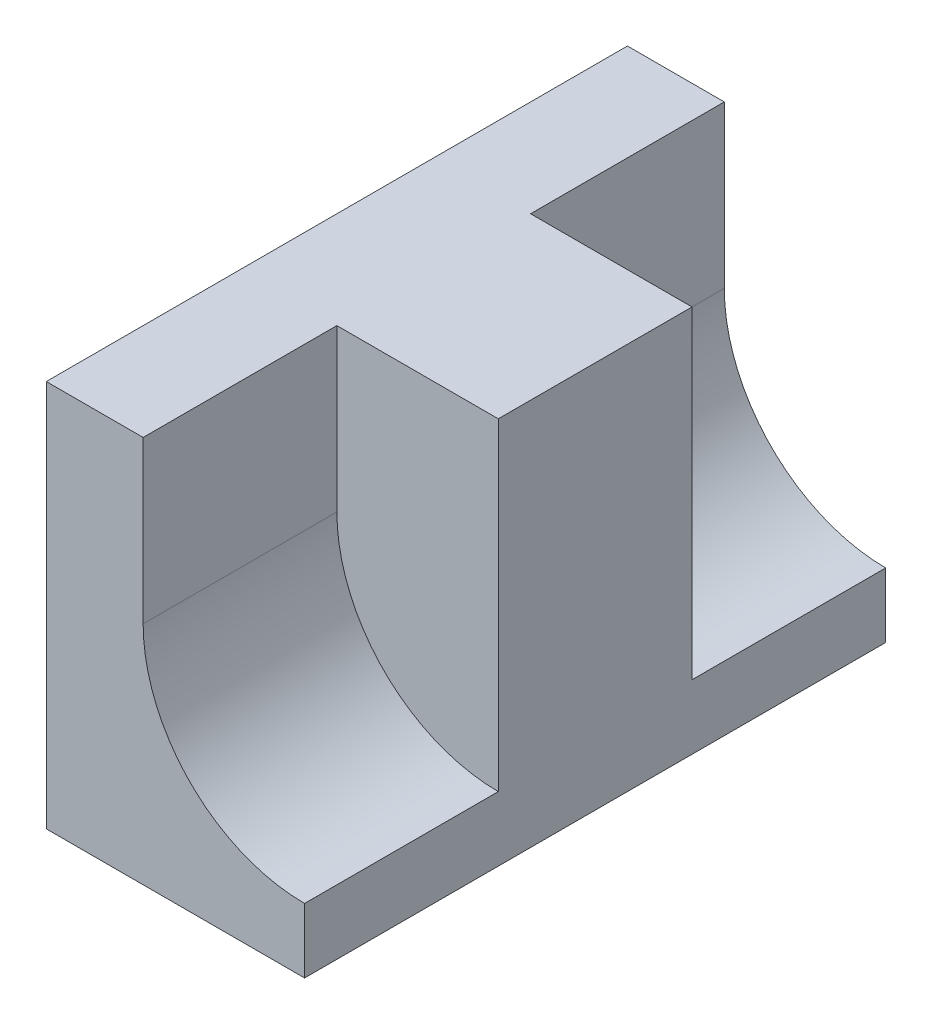
ISO-10303-21;
HEADER;
FILE_DESCRIPTION(('STEP AP214'),'2;1');
FILE_NAME('part.step','',(''),(''),'','','');
FILE_SCHEMA(('AUTOMOTIVE_DESIGN { 1 0 10303 214 1 1 1 1 }'));
ENDSEC;
DATA;
#1=APPLICATION_CONTEXT('core data for automotive mechanical design processes');
#2=APPLICATION_PROTOCOL_DEFINITION('international standard','automotive_design',2000,#1);
#3=PRODUCT_CONTEXT('',#1,'mechanical');
#4=PRODUCT('Part','Part','',(#3));
#5=PRODUCT_RELATED_PRODUCT_CATEGORY('part','',(#4));
#6=PRODUCT_DEFINITION_FORMATION('','',#4);
#7=PRODUCT_DEFINITION_CONTEXT('part definition',#1,'design');
#8=PRODUCT_DEFINITION('design','',#6,#7);
#9=PRODUCT_DEFINITION_SHAPE('','',#8);
#10=(LENGTH_UNIT() NAMED_UNIT(*) SI_UNIT(.MILLI.,.METRE.));
#11=(NAMED_UNIT(*) PLANE_ANGLE_UNIT() SI_UNIT($,.RADIAN.));
#12=(NAMED_UNIT(*) SI_UNIT($,.STERADIAN.) SOLID_ANGLE_UNIT());
#13=UNCERTAINTY_MEASURE_WITH_UNIT(LENGTH_MEASURE(1.E-05),#10,'distance_accuracy_value','');
#14=(GEOMETRIC_REPRESENTATION_CONTEXT(3) GLOBAL_UNCERTAINTY_ASSIGNED_CONTEXT((#13)) GLOBAL_UNIT_ASSIGNED_CONTEXT((#10,
#11,#12)) REPRESENTATION_CONTEXT('',''));
#15=CARTESIAN_POINT('',(0.,0.,0.));
#16=DIRECTION('',(0.,0.,1.));
#17=DIRECTION('',(1.,0.,0.));
#18=AXIS2_PLACEMENT_3D('',#15,#16,#17);
#19=CARTESIAN_POINT('',(40.,35.,45.));
#20=DIRECTION('',(0.,0.,-1.));
#21=DIRECTION('',(-1.,0.,0.));
#22=AXIS2_PLACEMENT_3D('',#19,#20,#21);
#23=CYLINDRICAL_SURFACE('',#22,25.);
#24=DIRECTION('',(0.,0.,-1.));
#25=VECTOR('',#24,1.);
#26=CARTESIAN_POINT('',(15.,35.,45.));
#27=LINE('',#26,#25);
#28=CARTESIAN_POINT('',(15.,35.,-15.));
#29=VERTEX_POINT('',#28);
#30=CARTESIAN_POINT('',(15.,35.,-45.));
#31=VERTEX_POINT('',#30);
#32=EDGE_CURVE('E43',#29,#31,#27,.T.);
#33=ORIENTED_EDGE('',*,*,#32,.F.);
#34=CARTESIAN_POINT('',(40.,35.,-15.));
#35=DIRECTION('',(0.,0.,1.));
#36=DIRECTION('',(1.,0.,0.));
#37=AXIS2_PLACEMENT_3D('',#34,#35,#36);
#38=CIRCLE('',#37,25.);
#39=CARTESIAN_POINT('',(40.,10.,-15.));
#40=VERTEX_POINT('',#39);
#41=EDGE_CURVE('E140',#29,#40,#38,.T.);
#42=ORIENTED_EDGE('',*,*,#41,.T.);
#43=DIRECTION('',(0.,0.,-1.));
#44=VECTOR('',#43,1.);
#45=CARTESIAN_POINT('',(40.,10.,45.));
#46=LINE('',#45,#44);
#47=CARTESIAN_POINT('',(40.,10.,-45.));
#48=VERTEX_POINT('',#47);
#49=EDGE_CURVE('E163',#40,#48,#46,.T.);
#50=ORIENTED_EDGE('',*,*,#49,.T.);
#51=CARTESIAN_POINT('',(40.,35.,-45.));
#52=DIRECTION('',(0.,0.,1.));
#53=DIRECTION('',(1.,0.,0.));
#54=AXIS2_PLACEMENT_3D('',#51,#52,#53);
#55=CIRCLE('',#54,25.);
#56=EDGE_CURVE('E129',#31,#48,#55,.T.);
#57=ORIENTED_EDGE('',*,*,#56,.F.);
#58=EDGE_LOOP('',(#33,#42,#50,#57));
#59=FACE_BOUND('',#58,.T.);
#60=ADVANCED_FACE('F35',(#59),#23,.F.);
#61=CARTESIAN_POINT('',(15.,0.,45.));
#62=DIRECTION('',(1.,0.,0.));
#63=DIRECTION('',(0.,1.,0.));
#64=AXIS2_PLACEMENT_3D('',#61,#62,#63);
#65=PLANE('',#64);
#66=DIRECTION('',(0.,0.,-1.));
#67=VECTOR('',#66,1.);
#68=CARTESIAN_POINT('',(15.,60.,45.));
#69=LINE('',#68,#67);
#70=CARTESIAN_POINT('',(15.,60.,-15.));
#71=VERTEX_POINT('',#70);
#72=CARTESIAN_POINT('',(15.,60.,-45.));
#73=VERTEX_POINT('',#72);
#74=EDGE_CURVE('E186',#71,#73,#69,.T.);
#75=ORIENTED_EDGE('',*,*,#74,.F.);
#76=DIRECTION('',(0.,-1.,0.));
#77=VECTOR('',#76,1.);
#78=CARTESIAN_POINT('',(15.,0.,-15.));
#79=LINE('',#78,#77);
#80=EDGE_CURVE('E50',#71,#29,#79,.T.);
#81=ORIENTED_EDGE('',*,*,#80,.T.);
#82=ORIENTED_EDGE('',*,*,#32,.T.);
#83=DIRECTION('',(0.,-1.,0.));
#84=VECTOR('',#83,1.);
#85=CARTESIAN_POINT('',(15.,0.,-45.));
#86=LINE('',#85,#84);
#87=EDGE_CURVE('E166',#73,#31,#86,.T.);
#88=ORIENTED_EDGE('',*,*,#87,.F.);
#89=EDGE_LOOP('',(#75,#81,#82,#88));
#90=FACE_BOUND('',#89,.T.);
#91=ADVANCED_FACE('F188',(#90),#65,.T.);
#92=CARTESIAN_POINT('',(40.,35.,15.));
#93=DIRECTION('',(0.,0.,1.));
#94=DIRECTION('',(1.,0.,0.));
#95=AXIS2_PLACEMENT_3D('',#92,#93,#94);
#96=CIRCLE('',#95,25.);
#97=CARTESIAN_POINT('',(15.,35.,15.));
#98=VERTEX_POINT('',#97);
#99=CARTESIAN_POINT('',(40.,10.,15.));
#100=VERTEX_POINT('',#99);
#101=EDGE_CURVE('E58',#98,#100,#96,.T.);
#102=ORIENTED_EDGE('',*,*,#101,.F.);
#103=CARTESIAN_POINT('',(15.,35.,45.));
#104=VERTEX_POINT('',#103);
#105=EDGE_CURVE('E11',#104,#98,#27,.T.);
#106=ORIENTED_EDGE('',*,*,#105,.F.);
#107=CARTESIAN_POINT('',(40.,35.,45.));
#108=DIRECTION('',(0.,0.,1.));
#109=DIRECTION('',(1.,0.,0.));
#110=AXIS2_PLACEMENT_3D('',#107,#108,#109);
#111=CIRCLE('',#110,25.);
#112=CARTESIAN_POINT('',(40.,10.,45.));
#113=VERTEX_POINT('',#112);
#114=EDGE_CURVE('E147',#104,#113,#111,.T.);
#115=ORIENTED_EDGE('',*,*,#114,.T.);
#116=EDGE_CURVE('E178',#113,#100,#46,.T.);
#117=ORIENTED_EDGE('',*,*,#116,.T.);
#118=EDGE_LOOP('',(#102,#106,#115,#117));
#119=FACE_BOUND('',#118,.T.);
#120=ADVANCED_FACE('F37',(#119),#23,.F.);
#121=DIRECTION('',(0.,-1.,0.));
#122=VECTOR('',#121,1.);
#123=CARTESIAN_POINT('',(15.,0.,15.));
#124=LINE('',#123,#122);
#125=CARTESIAN_POINT('',(15.,60.,15.));
#126=VERTEX_POINT('',#125);
#127=EDGE_CURVE('E145',#126,#98,#124,.T.);
#128=ORIENTED_EDGE('',*,*,#127,.F.);
#129=CARTESIAN_POINT('',(15.,60.,45.));
#130=VERTEX_POINT('',#129);
#131=EDGE_CURVE('E135',#130,#126,#69,.T.);
#132=ORIENTED_EDGE('',*,*,#131,.F.);
#133=DIRECTION('',(0.,-1.,0.));
#134=VECTOR('',#133,1.);
#135=CARTESIAN_POINT('',(15.,0.,45.));
#136=LINE('',#135,#134);
#137=EDGE_CURVE('E150',#130,#104,#136,.T.);
#138=ORIENTED_EDGE('',*,*,#137,.T.);
#139=ORIENTED_EDGE('',*,*,#105,.T.);
#140=EDGE_LOOP('',(#128,#132,#138,#139));
#141=FACE_BOUND('',#140,.T.);
#142=ADVANCED_FACE('F205',(#141),#65,.T.);
#143=CARTESIAN_POINT('',(0.,60.,45.));
#144=DIRECTION('',(0.,1.,0.));
#145=DIRECTION('',(0.,0.,1.));
#146=AXIS2_PLACEMENT_3D('',#143,#144,#145);
#147=PLANE('',#146);
#148=DIRECTION('',(1.,0.,0.));
#149=VECTOR('',#148,1.);
#150=CARTESIAN_POINT('',(0.,60.,-45.));
#151=LINE('',#150,#149);
#152=CARTESIAN_POINT('',(0.,60.,-45.));
#153=VERTEX_POINT('',#152);
#154=EDGE_CURVE('E169',#153,#73,#151,.T.);
#155=ORIENTED_EDGE('',*,*,#154,.F.);
#156=DIRECTION('',(0.,0.,-1.));
#157=VECTOR('',#156,1.);
#158=CARTESIAN_POINT('',(0.,60.,45.));
#159=LINE('',#158,#157);
#160=CARTESIAN_POINT('',(0.,60.,45.));
#161=VERTEX_POINT('',#160);
#162=EDGE_CURVE('E185',#161,#153,#159,.T.);
#163=ORIENTED_EDGE('',*,*,#162,.F.);
#164=DIRECTION('',(1.,0.,0.));
#165=VECTOR('',#164,1.);
#166=CARTESIAN_POINT('',(0.,60.,45.));
#167=LINE('',#166,#165);
#168=EDGE_CURVE('E154',#161,#130,#167,.T.);
#169=ORIENTED_EDGE('',*,*,#168,.T.);
#170=ORIENTED_EDGE('',*,*,#131,.T.);
#171=DIRECTION('',(1.,0.,0.));
#172=VECTOR('',#171,1.);
#173=CARTESIAN_POINT('',(0.,60.,15.));
#174=LINE('',#173,#172);
#175=CARTESIAN_POINT('',(40.,60.,15.));
#176=VERTEX_POINT('',#175);
#177=EDGE_CURVE('E116',#126,#176,#174,.T.);
#178=ORIENTED_EDGE('',*,*,#177,.T.);
#179=DIRECTION('',(0.,0.,-1.));
#180=VECTOR('',#179,1.);
#181=CARTESIAN_POINT('',(40.,60.,15.));
#182=LINE('',#181,#180);
#183=CARTESIAN_POINT('',(40.,60.,-15.));
#184=VERTEX_POINT('',#183);
#185=EDGE_CURVE('E121',#176,#184,#182,.T.);
#186=ORIENTED_EDGE('',*,*,#185,.T.);
#187=DIRECTION('',(1.,0.,0.));
#188=VECTOR('',#187,1.);
#189=CARTESIAN_POINT('',(0.,60.,-15.));
#190=LINE('',#189,#188);
#191=EDGE_CURVE('E144',#71,#184,#190,.T.);
#192=ORIENTED_EDGE('',*,*,#191,.F.);
#193=ORIENTED_EDGE('',*,*,#74,.T.);
#194=EDGE_LOOP('',(#155,#163,#169,#170,#178,#186,#192,#193));
#195=FACE_BOUND('',#194,.T.);
#196=ADVANCED_FACE('F133',(#195),#147,.T.);
#197=CARTESIAN_POINT('',(0.,0.,45.));
#198=DIRECTION('',(-1.,0.,0.));
#199=DIRECTION('',(0.,0.,1.));
#200=AXIS2_PLACEMENT_3D('',#197,#198,#199);
#201=PLANE('',#200);
#202=DIRECTION('',(0.,1.,0.));
#203=VECTOR('',#202,1.);
#204=CARTESIAN_POINT('',(0.,0.,-45.));
#205=LINE('',#204,#203);
#206=CARTESIAN_POINT('',(0.,0.,-45.));
#207=VERTEX_POINT('',#206);
#208=EDGE_CURVE('E172',#207,#153,#205,.T.);
#209=ORIENTED_EDGE('',*,*,#208,.F.);
#210=DIRECTION('',(0.,0.,-1.));
#211=VECTOR('',#210,1.);
#212=CARTESIAN_POINT('',(0.,0.,45.));
#213=LINE('',#212,#211);
#214=CARTESIAN_POINT('',(0.,0.,45.));
#215=VERTEX_POINT('',#214);
#216=EDGE_CURVE('E183',#215,#207,#213,.T.);
#217=ORIENTED_EDGE('',*,*,#216,.F.);
#218=DIRECTION('',(0.,1.,0.));
#219=VECTOR('',#218,1.);
#220=CARTESIAN_POINT('',(0.,0.,45.));
#221=LINE('',#220,#219);
#222=EDGE_CURVE('E156',#215,#161,#221,.T.);
#223=ORIENTED_EDGE('',*,*,#222,.T.);
#224=ORIENTED_EDGE('',*,*,#162,.T.);
#225=EDGE_LOOP('',(#209,#217,#223,#224));
#226=FACE_BOUND('',#225,.T.);
#227=ADVANCED_FACE('F196',(#226),#201,.T.);
#228=CARTESIAN_POINT('',(0.,0.,45.));
#229=DIRECTION('',(0.,1.,0.));
#230=DIRECTION('',(0.,0.,1.));
#231=AXIS2_PLACEMENT_3D('',#228,#229,#230);
#232=PLANE('',#231);
#233=DIRECTION('',(1.,0.,0.));
#234=VECTOR('',#233,1.);
#235=CARTESIAN_POINT('',(0.,0.,-45.));
#236=LINE('',#235,#234);
#237=CARTESIAN_POINT('',(40.,0.,-45.));
#238=VERTEX_POINT('',#237);
#239=EDGE_CURVE('E175',#207,#238,#236,.T.);
#240=ORIENTED_EDGE('',*,*,#239,.T.);
#241=DIRECTION('',(0.,0.,-1.));
#242=VECTOR('',#241,1.);
#243=CARTESIAN_POINT('',(40.,0.,45.));
#244=LINE('',#243,#242);
#245=CARTESIAN_POINT('',(40.,0.,45.));
#246=VERTEX_POINT('',#245);
#247=EDGE_CURVE('E180',#246,#238,#244,.T.);
#248=ORIENTED_EDGE('',*,*,#247,.F.);
#249=DIRECTION('',(1.,0.,0.));
#250=VECTOR('',#249,1.);
#251=CARTESIAN_POINT('',(0.,0.,45.));
#252=LINE('',#251,#250);
#253=EDGE_CURVE('E159',#215,#246,#252,.T.);
#254=ORIENTED_EDGE('',*,*,#253,.F.);
#255=ORIENTED_EDGE('',*,*,#216,.T.);
#256=EDGE_LOOP('',(#240,#248,#254,#255));
#257=FACE_BOUND('',#256,.T.);
#258=ADVANCED_FACE('F210',(#257),#232,.F.);
#259=CARTESIAN_POINT('',(40.,0.,45.));
#260=DIRECTION('',(-1.,0.,0.));
#261=DIRECTION('',(0.,0.,1.));
#262=AXIS2_PLACEMENT_3D('',#259,#260,#261);
#263=PLANE('',#262);
#264=DIRECTION('',(0.,1.,0.));
#265=VECTOR('',#264,1.);
#266=CARTESIAN_POINT('',(40.,0.,-45.));
#267=LINE('',#266,#265);
#268=EDGE_CURVE('E151',#238,#48,#267,.T.);
#269=ORIENTED_EDGE('',*,*,#268,.T.);
#270=ORIENTED_EDGE('',*,*,#49,.F.);
#271=DIRECTION('',(0.,1.,0.));
#272=VECTOR('',#271,1.);
#273=CARTESIAN_POINT('',(40.,0.,-15.));
#274=LINE('',#273,#272);
#275=EDGE_CURVE('E125',#40,#184,#274,.T.);
#276=ORIENTED_EDGE('',*,*,#275,.T.);
#277=ORIENTED_EDGE('',*,*,#185,.F.);
#278=DIRECTION('',(0.,1.,0.));
#279=VECTOR('',#278,1.);
#280=CARTESIAN_POINT('',(40.,0.,15.));
#281=LINE('',#280,#279);
#282=EDGE_CURVE('E111',#100,#176,#281,.T.);
#283=ORIENTED_EDGE('',*,*,#282,.F.);
#284=ORIENTED_EDGE('',*,*,#116,.F.);
#285=DIRECTION('',(0.,1.,0.));
#286=VECTOR('',#285,1.);
#287=CARTESIAN_POINT('',(40.,0.,45.));
#288=LINE('',#287,#286);
#289=EDGE_CURVE('E161',#246,#113,#288,.T.);
#290=ORIENTED_EDGE('',*,*,#289,.F.);
#291=ORIENTED_EDGE('',*,*,#247,.T.);
#292=EDGE_LOOP('',(#269,#270,#276,#277,#283,#284,#290,#291));
#293=FACE_BOUND('',#292,.T.);
#294=ADVANCED_FACE('F123',(#293),#263,.F.);
#295=CARTESIAN_POINT('',(0.,0.,45.));
#296=DIRECTION('',(0.,0.,1.));
#297=DIRECTION('',(1.,0.,0.));
#298=AXIS2_PLACEMENT_3D('',#295,#296,#297);
#299=PLANE('',#298);
#300=ORIENTED_EDGE('',*,*,#114,.F.);
#301=ORIENTED_EDGE('',*,*,#137,.F.);
#302=ORIENTED_EDGE('',*,*,#168,.F.);
#303=ORIENTED_EDGE('',*,*,#222,.F.);
#304=ORIENTED_EDGE('',*,*,#253,.T.);
#305=ORIENTED_EDGE('',*,*,#289,.T.);
#306=EDGE_LOOP('',(#300,#301,#302,#303,#304,#305));
#307=FACE_BOUND('',#306,.T.);
#308=ADVANCED_FACE('F203',(#307),#299,.T.);
#309=CARTESIAN_POINT('',(0.,0.,-45.));
#310=DIRECTION('',(0.,0.,1.));
#311=DIRECTION('',(1.,0.,0.));
#312=AXIS2_PLACEMENT_3D('',#309,#310,#311);
#313=PLANE('',#312);
#314=ORIENTED_EDGE('',*,*,#56,.T.);
#315=ORIENTED_EDGE('',*,*,#268,.F.);
#316=ORIENTED_EDGE('',*,*,#239,.F.);
#317=ORIENTED_EDGE('',*,*,#208,.T.);
#318=ORIENTED_EDGE('',*,*,#154,.T.);
#319=ORIENTED_EDGE('',*,*,#87,.T.);
#320=EDGE_LOOP('',(#314,#315,#316,#317,#318,#319));
#321=FACE_BOUND('',#320,.T.);
#322=ADVANCED_FACE('F191',(#321),#313,.F.);
#323=CARTESIAN_POINT('',(0.,0.,15.));
#324=DIRECTION('',(0.,0.,1.));
#325=DIRECTION('',(1.,0.,0.));
#326=AXIS2_PLACEMENT_3D('',#323,#324,#325);
#327=PLANE('',#326);
#328=ORIENTED_EDGE('',*,*,#127,.T.);
#329=ORIENTED_EDGE('',*,*,#101,.T.);
#330=ORIENTED_EDGE('',*,*,#282,.T.);
#331=ORIENTED_EDGE('',*,*,#177,.F.);
#332=EDGE_LOOP('',(#328,#329,#330,#331));
#333=FACE_BOUND('',#332,.T.);
#334=ADVANCED_FACE('F114',(#333),#327,.T.);
#335=CARTESIAN_POINT('',(0.,0.,-15.));
#336=DIRECTION('',(0.,0.,1.));
#337=DIRECTION('',(1.,0.,0.));
#338=AXIS2_PLACEMENT_3D('',#335,#336,#337);
#339=PLANE('',#338);
#340=ORIENTED_EDGE('',*,*,#80,.F.);
#341=ORIENTED_EDGE('',*,*,#191,.T.);
#342=ORIENTED_EDGE('',*,*,#275,.F.);
#343=ORIENTED_EDGE('',*,*,#41,.F.);
#344=EDGE_LOOP('',(#340,#341,#342,#343));
#345=FACE_BOUND('',#344,.T.);
#346=ADVANCED_FACE('F303',(#345),#339,.F.);
#347=CLOSED_SHELL('',(#60,#91,#120,#142,#196,#227,#258,#294,#308,#322,#334,#346));
#348=MANIFOLD_SOLID_BREP('B2',#347);
#349=ADVANCED_BREP_SHAPE_REPRESENTATION('',(#18,#348),#14);
#350=SHAPE_DEFINITION_REPRESENTATION(#9,#349);
ENDSEC;
END-ISO-10303-21;
